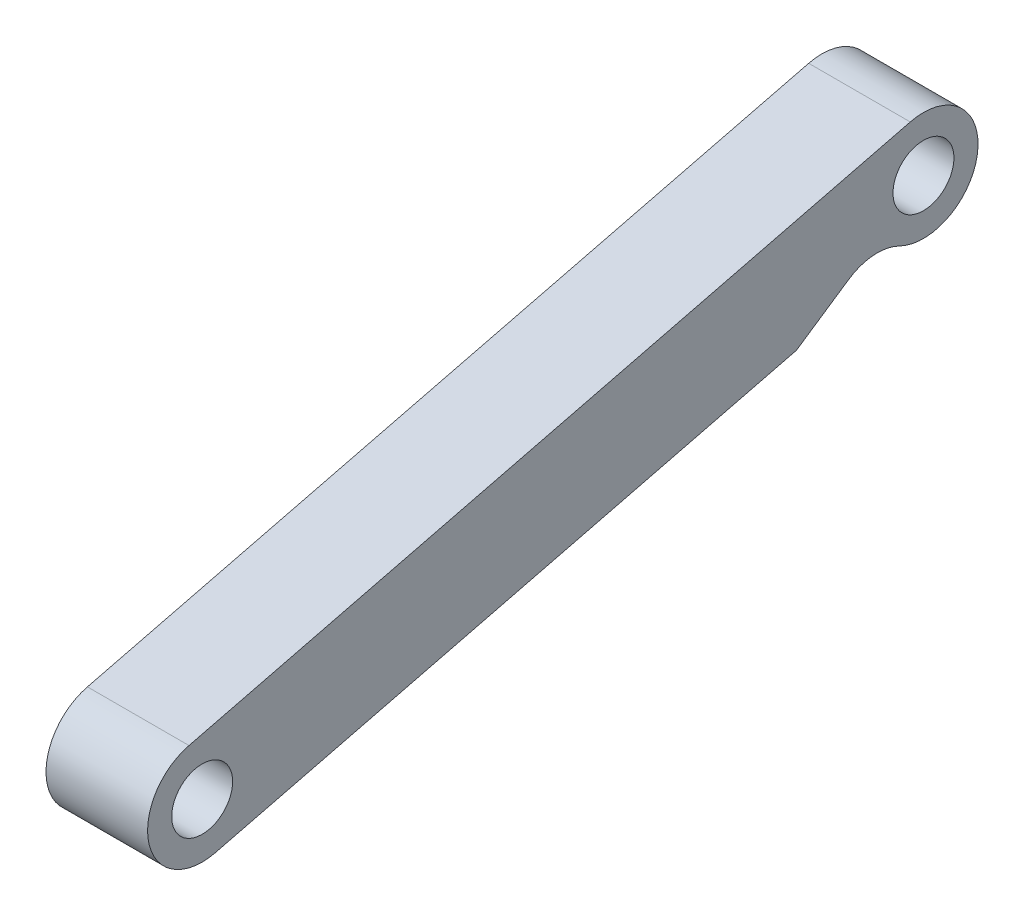
ISO-10303-21;
HEADER;
FILE_DESCRIPTION(('STEP AP214'),'2;1');
FILE_NAME('part.step','',(''),(''),'','','');
FILE_SCHEMA(('AUTOMOTIVE_DESIGN { 1 0 10303 214 1 1 1 1 }'));
ENDSEC;
DATA;
#1=APPLICATION_CONTEXT('core data for automotive mechanical design processes');
#2=APPLICATION_PROTOCOL_DEFINITION('international standard','automotive_design',2000,#1);
#3=PRODUCT_CONTEXT('',#1,'mechanical');
#4=PRODUCT('Part','Part','',(#3));
#5=PRODUCT_RELATED_PRODUCT_CATEGORY('part','',(#4));
#6=PRODUCT_DEFINITION_FORMATION('','',#4);
#7=PRODUCT_DEFINITION_CONTEXT('part definition',#1,'design');
#8=PRODUCT_DEFINITION('design','',#6,#7);
#9=PRODUCT_DEFINITION_SHAPE('','',#8);
#10=(LENGTH_UNIT() NAMED_UNIT(*) SI_UNIT(.MILLI.,.METRE.));
#11=(NAMED_UNIT(*) PLANE_ANGLE_UNIT() SI_UNIT($,.RADIAN.));
#12=(NAMED_UNIT(*) SI_UNIT($,.STERADIAN.) SOLID_ANGLE_UNIT());
#13=UNCERTAINTY_MEASURE_WITH_UNIT(LENGTH_MEASURE(1.E-05),#10,'distance_accuracy_value','');
#14=(GEOMETRIC_REPRESENTATION_CONTEXT(3) GLOBAL_UNCERTAINTY_ASSIGNED_CONTEXT((#13)) GLOBAL_UNIT_ASSIGNED_CONTEXT((#10,
#11,#12)) REPRESENTATION_CONTEXT('',''));
#15=CARTESIAN_POINT('',(0.,0.,0.));
#16=DIRECTION('',(0.,0.,1.));
#17=DIRECTION('',(1.,0.,0.));
#18=AXIS2_PLACEMENT_3D('',#15,#16,#17);
#19=CARTESIAN_POINT('',(-2.,-11.142986567367,-2.77146766811159));
#20=DIRECTION('',(0.,-0.970434393018363,-0.241365053077453));
#21=DIRECTION('',(0.,0.241365053077453,-0.970434393018363));
#22=AXIS2_PLACEMENT_3D('',#19,#20,#21);
#23=PLANE('',#22);
#24=DIRECTION('',(1.,0.,0.));
#25=VECTOR('',#24,1.);
#26=CARTESIAN_POINT('',(-2.,-1.91356605501053,-39.879354574779));
#27=LINE('',#26,#25);
#28=CARTESIAN_POINT('',(-2.,-1.91356605501053,-39.879354574779));
#29=VERTEX_POINT('',#28);
#30=CARTESIAN_POINT('',(2.,-1.91356605501053,-39.879354574779));
#31=VERTEX_POINT('',#30);
#32=EDGE_CURVE('E42',#29,#31,#27,.T.);
#33=ORIENTED_EDGE('',*,*,#32,.T.);
#34=DIRECTION('',(0.,0.241365053077453,-0.970434393018363));
#35=VECTOR('',#34,1.);
#36=CARTESIAN_POINT('',(2.,-11.142986567367,-2.77146766811159));
#37=LINE('',#36,#35);
#38=CARTESIAN_POINT('',(2.,5.15061171746536,-68.2816480360722));
#39=VERTEX_POINT('',#38);
#40=EDGE_CURVE('E95',#31,#39,#37,.T.);
#41=ORIENTED_EDGE('',*,*,#40,.T.);
#42=DIRECTION('',(1.,0.,0.));
#43=VECTOR('',#42,1.);
#44=CARTESIAN_POINT('',(-2.,5.15061171746536,-68.2816480360722));
#45=LINE('',#44,#43);
#46=CARTESIAN_POINT('',(-2.,5.15061171746536,-68.2816480360722));
#47=VERTEX_POINT('',#46);
#48=EDGE_CURVE('E11',#47,#39,#45,.T.);
#49=ORIENTED_EDGE('',*,*,#48,.F.);
#50=DIRECTION('',(0.,0.241365053077453,-0.970434393018363));
#51=VECTOR('',#50,1.);
#52=CARTESIAN_POINT('',(-2.,-11.142986567367,-2.77146766811159));
#53=LINE('',#52,#51);
#54=EDGE_CURVE('E55',#29,#47,#53,.T.);
#55=ORIENTED_EDGE('',*,*,#54,.F.);
#56=EDGE_LOOP('',(#33,#41,#49,#55));
#57=FACE_BOUND('',#56,.T.);
#58=ADVANCED_FACE('F39',(#57),#23,.F.);
#59=CARTESIAN_POINT('',(-2.,3.06417777247588,-68.8005829001888));
#60=DIRECTION('',(1.,0.,0.));
#61=DIRECTION('',(0.,0.,-1.));
#62=AXIS2_PLACEMENT_3D('',#59,#60,#61);
#63=CYLINDRICAL_SURFACE('',#62,2.15);
#64=ORIENTED_EDGE('',*,*,#48,.T.);
#65=CARTESIAN_POINT('',(2.,3.06417777247588,-68.8005829001888));
#66=DIRECTION('',(1.,0.,0.));
#67=DIRECTION('',(0.,0.,-1.));
#68=AXIS2_PLACEMENT_3D('',#65,#66,#67);
#69=CIRCLE('',#68,2.15);
#70=CARTESIAN_POINT('',(2.,1.13224759562641,-67.8571075206593));
#71=VERTEX_POINT('',#70);
#72=EDGE_CURVE('E112',#71,#39,#69,.T.);
#73=ORIENTED_EDGE('',*,*,#72,.F.);
#74=DIRECTION('',(1.,0.,0.));
#75=VECTOR('',#74,1.);
#76=CARTESIAN_POINT('',(-2.,1.13224759562641,-67.8571075206593));
#77=LINE('',#76,#75);
#78=CARTESIAN_POINT('',(-2.,1.13224759562641,-67.8571075206593));
#79=VERTEX_POINT('',#78);
#80=EDGE_CURVE('E47',#79,#71,#77,.T.);
#81=ORIENTED_EDGE('',*,*,#80,.F.);
#82=CARTESIAN_POINT('',(-2.,3.06417777247588,-68.8005829001888));
#83=DIRECTION('',(1.,0.,0.));
#84=DIRECTION('',(0.,0.,-1.));
#85=AXIS2_PLACEMENT_3D('',#82,#83,#84);
#86=CIRCLE('',#85,2.15);
#87=EDGE_CURVE('E140',#79,#47,#86,.T.);
#88=ORIENTED_EDGE('',*,*,#87,.T.);
#89=EDGE_LOOP('',(#64,#73,#81,#88));
#90=FACE_BOUND('',#89,.T.);
#91=ADVANCED_FACE('F161',(#90),#63,.T.);
#92=CARTESIAN_POINT('',(-2.,-0.664896754931248,-66.9794560048178));
#93=DIRECTION('',(1.,0.,0.));
#94=DIRECTION('',(0.,0.,-1.));
#95=AXIS2_PLACEMENT_3D('',#92,#93,#94);
#96=CYLINDRICAL_SURFACE('',#95,2.);
#97=ORIENTED_EDGE('',*,*,#80,.T.);
#98=CARTESIAN_POINT('',(2.,-0.664896754931248,-66.9794560048178));
#99=DIRECTION('',(1.,0.,0.));
#100=DIRECTION('',(0.,0.,-1.));
#101=AXIS2_PLACEMENT_3D('',#98,#99,#100);
#102=CIRCLE('',#101,2.);
#103=CARTESIAN_POINT('',(2.,0.993819901126462,-65.8620218658563));
#104=VERTEX_POINT('',#103);
#105=EDGE_CURVE('E119',#71,#104,#102,.T.);
#106=ORIENTED_EDGE('',*,*,#105,.T.);
#107=DIRECTION('',(1.,0.,0.));
#108=VECTOR('',#107,1.);
#109=CARTESIAN_POINT('',(-2.,0.993819901126462,-65.8620218658563));
#110=LINE('',#109,#108);
#111=CARTESIAN_POINT('',(-2.,0.993819901126462,-65.8620218658563));
#112=VERTEX_POINT('',#111);
#113=EDGE_CURVE('E148',#112,#104,#110,.T.);
#114=ORIENTED_EDGE('',*,*,#113,.F.);
#115=CARTESIAN_POINT('',(-2.,-0.664896754931248,-66.9794560048178));
#116=DIRECTION('',(1.,0.,0.));
#117=DIRECTION('',(0.,0.,-1.));
#118=AXIS2_PLACEMENT_3D('',#115,#116,#117);
#119=CIRCLE('',#118,2.);
#120=EDGE_CURVE('E138',#79,#112,#119,.T.);
#121=ORIENTED_EDGE('',*,*,#120,.F.);
#122=EDGE_LOOP('',(#97,#106,#114,#121));
#123=FACE_BOUND('',#122,.T.);
#124=ADVANCED_FACE('F160',(#123),#96,.F.);
#125=CARTESIAN_POINT('',(-2.,-29.8353390099526,-20.0992895534372));
#126=DIRECTION('',(0.,-0.829358328028849,-0.558717069480781));
#127=DIRECTION('',(0.,0.558717069480781,-0.829358328028849));
#128=AXIS2_PLACEMENT_3D('',#125,#126,#127);
#129=PLANE('',#128);
#130=ORIENTED_EDGE('',*,*,#113,.T.);
#131=DIRECTION('',(0.,0.558717069480781,-0.829358328028849));
#132=VECTOR('',#131,1.);
#133=CARTESIAN_POINT('',(2.,-29.8353390099526,-20.0992895534372));
#134=LINE('',#133,#132);
#135=CARTESIAN_POINT('',(2.,-0.394917751690836,-63.8005829001888));
#136=VERTEX_POINT('',#135);
#137=EDGE_CURVE('E116',#136,#104,#134,.T.);
#138=ORIENTED_EDGE('',*,*,#137,.F.);
#139=DIRECTION('',(1.,0.,0.));
#140=VECTOR('',#139,1.);
#141=CARTESIAN_POINT('',(-2.,-0.394917751690836,-63.8005829001888));
#142=LINE('',#141,#140);
#143=CARTESIAN_POINT('',(-2.,-0.394917751690836,-63.8005829001888));
#144=VERTEX_POINT('',#143);
#145=EDGE_CURVE('E150',#144,#136,#142,.T.);
#146=ORIENTED_EDGE('',*,*,#145,.F.);
#147=DIRECTION('',(0.,0.558717069480781,-0.829358328028849));
#148=VECTOR('',#147,1.);
#149=CARTESIAN_POINT('',(-2.,-29.8353390099526,-20.0992895534372));
#150=LINE('',#149,#148);
#151=EDGE_CURVE('E135',#144,#112,#150,.T.);
#152=ORIENTED_EDGE('',*,*,#151,.T.);
#153=EDGE_LOOP('',(#130,#138,#146,#152));
#154=FACE_BOUND('',#153,.T.);
#155=ADVANCED_FACE('F157',(#154),#129,.T.);
#156=CARTESIAN_POINT('',(-2.,-15.315854457346,-3.80933739634463));
#157=DIRECTION('',(0.,-0.970434393018363,-0.241365053077453));
#158=DIRECTION('',(0.,0.241365053077453,-0.970434393018363));
#159=AXIS2_PLACEMENT_3D('',#156,#157,#158);
#160=PLANE('',#159);
#161=ORIENTED_EDGE('',*,*,#145,.T.);
#162=DIRECTION('',(0.,0.241365053077453,-0.970434393018363));
#163=VECTOR('',#162,1.);
#164=CARTESIAN_POINT('',(2.,-15.315854457346,-3.80933739634463));
#165=LINE('',#164,#163);
#166=CARTESIAN_POINT('',(2.,-6.08643394498948,-40.917224303012));
#167=VERTEX_POINT('',#166);
#168=EDGE_CURVE('E106',#167,#136,#165,.T.);
#169=ORIENTED_EDGE('',*,*,#168,.F.);
#170=DIRECTION('',(1.,0.,0.));
#171=VECTOR('',#170,1.);
#172=CARTESIAN_POINT('',(-2.,-6.08643394498948,-40.917224303012));
#173=LINE('',#172,#171);
#174=CARTESIAN_POINT('',(-2.,-6.08643394498948,-40.917224303012));
#175=VERTEX_POINT('',#174);
#176=EDGE_CURVE('E98',#175,#167,#173,.T.);
#177=ORIENTED_EDGE('',*,*,#176,.F.);
#178=DIRECTION('',(0.,0.241365053077453,-0.970434393018363));
#179=VECTOR('',#178,1.);
#180=CARTESIAN_POINT('',(-2.,-15.315854457346,-3.80933739634463));
#181=LINE('',#180,#179);
#182=EDGE_CURVE('E132',#175,#144,#181,.T.);
#183=ORIENTED_EDGE('',*,*,#182,.T.);
#184=EDGE_LOOP('',(#161,#169,#177,#183));
#185=FACE_BOUND('',#184,.T.);
#186=ADVANCED_FACE('F152',(#185),#160,.T.);
#187=CARTESIAN_POINT('',(-2.,3.06417777247588,-68.8005829001888));
#188=DIRECTION('',(1.,0.,0.));
#189=DIRECTION('',(0.,0.,-1.));
#190=AXIS2_PLACEMENT_3D('',#187,#188,#189);
#191=CYLINDRICAL_SURFACE('',#190,1.2);
#192=CARTESIAN_POINT('',(-2.,3.06417777247588,-68.8005829001888));
#193=DIRECTION('',(1.,0.,0.));
#194=DIRECTION('',(0.,0.,-1.));
#195=AXIS2_PLACEMENT_3D('',#192,#193,#194);
#196=CIRCLE('',#195,1.2);
#197=CARTESIAN_POINT('',(-2.,3.06417777247588,-70.0005829001888));
#198=VERTEX_POINT('',#197);
#199=EDGE_CURVE('E142',#198,#198,#196,.T.);
#200=ORIENTED_EDGE('',*,*,#199,.F.);
#201=EDGE_LOOP('',(#200));
#202=FACE_BOUND('',#201,.T.);
#203=CARTESIAN_POINT('',(2.,3.06417777247588,-68.8005829001888));
#204=DIRECTION('',(1.,0.,0.));
#205=DIRECTION('',(0.,0.,-1.));
#206=AXIS2_PLACEMENT_3D('',#203,#204,#205);
#207=CIRCLE('',#206,1.2);
#208=CARTESIAN_POINT('',(2.,3.06417777247588,-70.0005829001888));
#209=VERTEX_POINT('',#208);
#210=EDGE_CURVE('E123',#209,#209,#207,.T.);
#211=ORIENTED_EDGE('',*,*,#210,.T.);
#212=EDGE_LOOP('',(#211));
#213=FACE_BOUND('',#212,.T.);
#214=ADVANCED_FACE('F190',(#202,#213),#191,.F.);
#215=CARTESIAN_POINT('',(-2.,-4.00000000000001,-40.3982894388955));
#216=DIRECTION('',(1.,0.,0.));
#217=DIRECTION('',(0.,0.,-1.));
#218=AXIS2_PLACEMENT_3D('',#215,#216,#217);
#219=CYLINDRICAL_SURFACE('',#218,2.15);
#220=ORIENTED_EDGE('',*,*,#176,.T.);
#221=CARTESIAN_POINT('',(2.,-4.00000000000001,-40.3982894388955));
#222=DIRECTION('',(1.,0.,0.));
#223=DIRECTION('',(0.,0.,-1.));
#224=AXIS2_PLACEMENT_3D('',#221,#222,#223);
#225=CIRCLE('',#224,2.15);
#226=EDGE_CURVE('E101',#31,#167,#225,.T.);
#227=ORIENTED_EDGE('',*,*,#226,.F.);
#228=ORIENTED_EDGE('',*,*,#32,.F.);
#229=CARTESIAN_POINT('',(-2.,-4.00000000000001,-40.3982894388955));
#230=DIRECTION('',(1.,0.,0.));
#231=DIRECTION('',(0.,0.,-1.));
#232=AXIS2_PLACEMENT_3D('',#229,#230,#231);
#233=CIRCLE('',#232,2.15);
#234=EDGE_CURVE('E130',#29,#175,#233,.T.);
#235=ORIENTED_EDGE('',*,*,#234,.T.);
#236=EDGE_LOOP('',(#220,#227,#228,#235));
#237=FACE_BOUND('',#236,.T.);
#238=ADVANCED_FACE('F102',(#237),#219,.T.);
#239=CARTESIAN_POINT('',(-2.,-4.00000000000001,-40.3982894388955));
#240=DIRECTION('',(1.,0.,0.));
#241=DIRECTION('',(0.,0.,-1.));
#242=AXIS2_PLACEMENT_3D('',#239,#240,#241);
#243=CYLINDRICAL_SURFACE('',#242,1.2);
#244=CARTESIAN_POINT('',(-2.,-4.00000000000001,-40.3982894388955));
#245=DIRECTION('',(1.,0.,0.));
#246=DIRECTION('',(0.,0.,-1.));
#247=AXIS2_PLACEMENT_3D('',#244,#245,#246);
#248=CIRCLE('',#247,1.2);
#249=CARTESIAN_POINT('',(-2.,-4.00000000000001,-41.5982894388955));
#250=VERTEX_POINT('',#249);
#251=EDGE_CURVE('E99',#250,#250,#248,.T.);
#252=ORIENTED_EDGE('',*,*,#251,.F.);
#253=EDGE_LOOP('',(#252));
#254=FACE_BOUND('',#253,.T.);
#255=CARTESIAN_POINT('',(2.,-4.00000000000001,-40.3982894388955));
#256=DIRECTION('',(1.,0.,0.));
#257=DIRECTION('',(0.,0.,-1.));
#258=AXIS2_PLACEMENT_3D('',#255,#256,#257);
#259=CIRCLE('',#258,1.2);
#260=CARTESIAN_POINT('',(2.,-4.00000000000001,-41.5982894388955));
#261=VERTEX_POINT('',#260);
#262=EDGE_CURVE('E126',#261,#261,#259,.T.);
#263=ORIENTED_EDGE('',*,*,#262,.T.);
#264=EDGE_LOOP('',(#263));
#265=FACE_BOUND('',#264,.T.);
#266=ADVANCED_FACE('F165',(#254,#265),#243,.F.);
#267=CARTESIAN_POINT('',(-2.,0.,0.));
#268=DIRECTION('',(1.,0.,0.));
#269=DIRECTION('',(0.,0.,-1.));
#270=AXIS2_PLACEMENT_3D('',#267,#268,#269);
#271=PLANE('',#270);
#272=ORIENTED_EDGE('',*,*,#54,.T.);
#273=ORIENTED_EDGE('',*,*,#87,.F.);
#274=ORIENTED_EDGE('',*,*,#120,.T.);
#275=ORIENTED_EDGE('',*,*,#151,.F.);
#276=ORIENTED_EDGE('',*,*,#182,.F.);
#277=ORIENTED_EDGE('',*,*,#234,.F.);
#278=EDGE_LOOP('',(#272,#273,#274,#275,#276,#277));
#279=FACE_BOUND('',#278,.T.);
#280=ORIENTED_EDGE('',*,*,#199,.T.);
#281=EDGE_LOOP('',(#280));
#282=FACE_BOUND('',#281,.T.);
#283=ORIENTED_EDGE('',*,*,#251,.T.);
#284=EDGE_LOOP('',(#283));
#285=FACE_BOUND('',#284,.T.);
#286=ADVANCED_FACE('F162',(#279,#282,#285),#271,.F.);
#287=CARTESIAN_POINT('',(2.,0.,0.));
#288=DIRECTION('',(1.,0.,0.));
#289=DIRECTION('',(0.,0.,-1.));
#290=AXIS2_PLACEMENT_3D('',#287,#288,#289);
#291=PLANE('',#290);
#292=ORIENTED_EDGE('',*,*,#40,.F.);
#293=ORIENTED_EDGE('',*,*,#226,.T.);
#294=ORIENTED_EDGE('',*,*,#168,.T.);
#295=ORIENTED_EDGE('',*,*,#137,.T.);
#296=ORIENTED_EDGE('',*,*,#105,.F.);
#297=ORIENTED_EDGE('',*,*,#72,.T.);
#298=EDGE_LOOP('',(#292,#293,#294,#295,#296,#297));
#299=FACE_BOUND('',#298,.T.);
#300=ORIENTED_EDGE('',*,*,#210,.F.);
#301=EDGE_LOOP('',(#300));
#302=FACE_BOUND('',#301,.T.);
#303=ORIENTED_EDGE('',*,*,#262,.F.);
#304=EDGE_LOOP('',(#303));
#305=FACE_BOUND('',#304,.T.);
#306=ADVANCED_FACE('F109',(#299,#302,#305),#291,.T.);
#307=CLOSED_SHELL('',(#58,#91,#124,#155,#186,#214,#238,#266,#286,#306));
#308=MANIFOLD_SOLID_BREP('B2',#307);
#309=ADVANCED_BREP_SHAPE_REPRESENTATION('',(#18,#308),#14);
#310=SHAPE_DEFINITION_REPRESENTATION(#9,#309);
ENDSEC;
END-ISO-10303-21;
